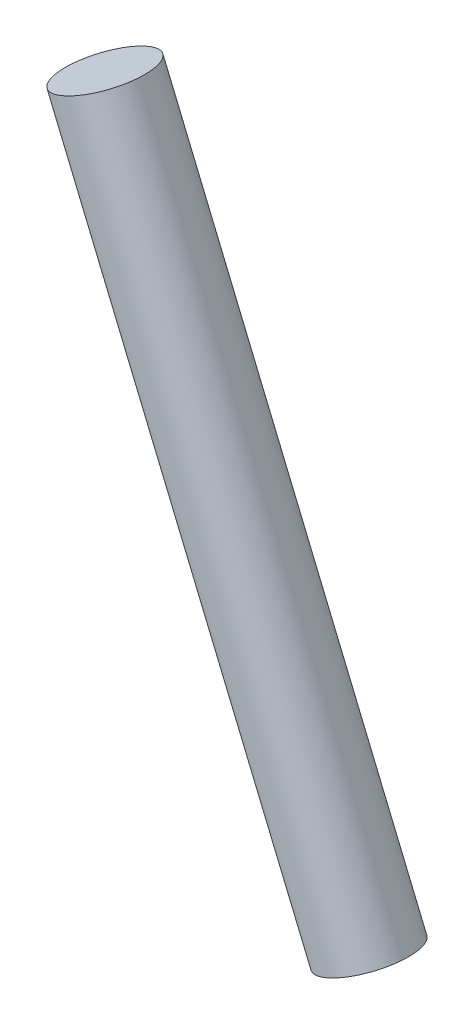
ISO-10303-21;
HEADER;
FILE_DESCRIPTION(('STEP AP214'),'2;1');
FILE_NAME('part.step','',(''),(''),'','','');
FILE_SCHEMA(('AUTOMOTIVE_DESIGN { 1 0 10303 214 1 1 1 1 }'));
ENDSEC;
DATA;
#1=APPLICATION_CONTEXT('core data for automotive mechanical design processes');
#2=APPLICATION_PROTOCOL_DEFINITION('international standard','automotive_design',2000,#1);
#3=PRODUCT_CONTEXT('',#1,'mechanical');
#4=PRODUCT('Part','Part','',(#3));
#5=PRODUCT_RELATED_PRODUCT_CATEGORY('part','',(#4));
#6=PRODUCT_DEFINITION_FORMATION('','',#4);
#7=PRODUCT_DEFINITION_CONTEXT('part definition',#1,'design');
#8=PRODUCT_DEFINITION('design','',#6,#7);
#9=PRODUCT_DEFINITION_SHAPE('','',#8);
#10=(LENGTH_UNIT() NAMED_UNIT(*) SI_UNIT(.MILLI.,.METRE.));
#11=(NAMED_UNIT(*) PLANE_ANGLE_UNIT() SI_UNIT($,.RADIAN.));
#12=(NAMED_UNIT(*) SI_UNIT($,.STERADIAN.) SOLID_ANGLE_UNIT());
#13=UNCERTAINTY_MEASURE_WITH_UNIT(LENGTH_MEASURE(1.E-05),#10,'distance_accuracy_value','');
#14=(GEOMETRIC_REPRESENTATION_CONTEXT(3) GLOBAL_UNCERTAINTY_ASSIGNED_CONTEXT((#13)) GLOBAL_UNIT_ASSIGNED_CONTEXT((#10,
#11,#12)) REPRESENTATION_CONTEXT('',''));
#15=CARTESIAN_POINT('',(0.,0.,0.));
#16=DIRECTION('',(0.,0.,1.));
#17=DIRECTION('',(1.,0.,0.));
#18=AXIS2_PLACEMENT_3D('',#15,#16,#17);
#19=CARTESIAN_POINT('',(73.1826883803696,82.0822993613163,42.5196));
#20=DIRECTION('',(-0.385624685451966,0.922655733180081,0.));
#21=DIRECTION('',(-0.922655733180081,-0.385624685451966,0.));
#22=AXIS2_PLACEMENT_3D('',#19,#20,#21);
#23=PLANE('',#22);
#24=CARTESIAN_POINT('',(73.1826883803694,82.0822993613163,42.5196));
#25=DIRECTION('',(0.385624685451969,-0.92265573318008,0.));
#26=DIRECTION('',(0.92265573318008,0.385624685451969,0.));
#27=AXIS2_PLACEMENT_3D('',#24,#25,#26);
#28=CIRCLE('',#27,1.190625);
#29=CARTESIAN_POINT('',(74.281225362687,82.5414337524326,42.5196));
#30=VERTEX_POINT('',#29);
#31=EDGE_CURVE('E18',#30,#30,#28,.T.);
#32=ORIENTED_EDGE('',*,*,#31,.F.);
#33=EDGE_LOOP('',(#32));
#34=FACE_BOUND('',#33,.T.);
#35=ADVANCED_FACE('F15',(#34),#23,.T.);
#36=CARTESIAN_POINT('',(80.5288386382295,64.5057076442357,42.5196));
#37=DIRECTION('',(0.385624685451966,-0.922655733180081,0.));
#38=DIRECTION('',(0.922655733180081,0.385624685451966,0.));
#39=AXIS2_PLACEMENT_3D('',#36,#37,#38);
#40=PLANE('',#39);
#41=CARTESIAN_POINT('',(80.5288386382295,64.5057076442357,42.5196));
#42=DIRECTION('',(0.385624685451969,-0.92265573318008,0.));
#43=DIRECTION('',(0.92265573318008,0.385624685451969,0.));
#44=AXIS2_PLACEMENT_3D('',#41,#42,#43);
#45=CIRCLE('',#44,1.190625);
#46=CARTESIAN_POINT('',(81.627375620547,64.964842035352,42.5196));
#47=VERTEX_POINT('',#46);
#48=EDGE_CURVE('E10',#47,#47,#45,.F.);
#49=ORIENTED_EDGE('',*,*,#48,.F.);
#50=EDGE_LOOP('',(#49));
#51=FACE_BOUND('',#50,.T.);
#52=ADVANCED_FACE('F30',(#51),#40,.T.);
#53=CARTESIAN_POINT('',(80.5288386382295,64.5057076442357,42.5196));
#54=DIRECTION('',(0.385624685451969,-0.92265573318008,0.));
#55=DIRECTION('',(0.92265573318008,0.385624685451969,0.));
#56=AXIS2_PLACEMENT_3D('',#53,#54,#55);
#57=CYLINDRICAL_SURFACE('',#56,1.190625);
#58=ORIENTED_EDGE('',*,*,#48,.T.);
#59=EDGE_LOOP('',(#58));
#60=FACE_BOUND('',#59,.T.);
#61=ORIENTED_EDGE('',*,*,#31,.T.);
#62=EDGE_LOOP('',(#61));
#63=FACE_BOUND('',#62,.T.);
#64=ADVANCED_FACE('F27',(#60,#63),#57,.T.);
#65=CLOSED_SHELL('',(#35,#52,#64));
#66=MANIFOLD_SOLID_BREP('B1',#65);
#67=ADVANCED_BREP_SHAPE_REPRESENTATION('',(#18,#66),#14);
#68=SHAPE_DEFINITION_REPRESENTATION(#9,#67);
ENDSEC;
END-ISO-10303-21;
